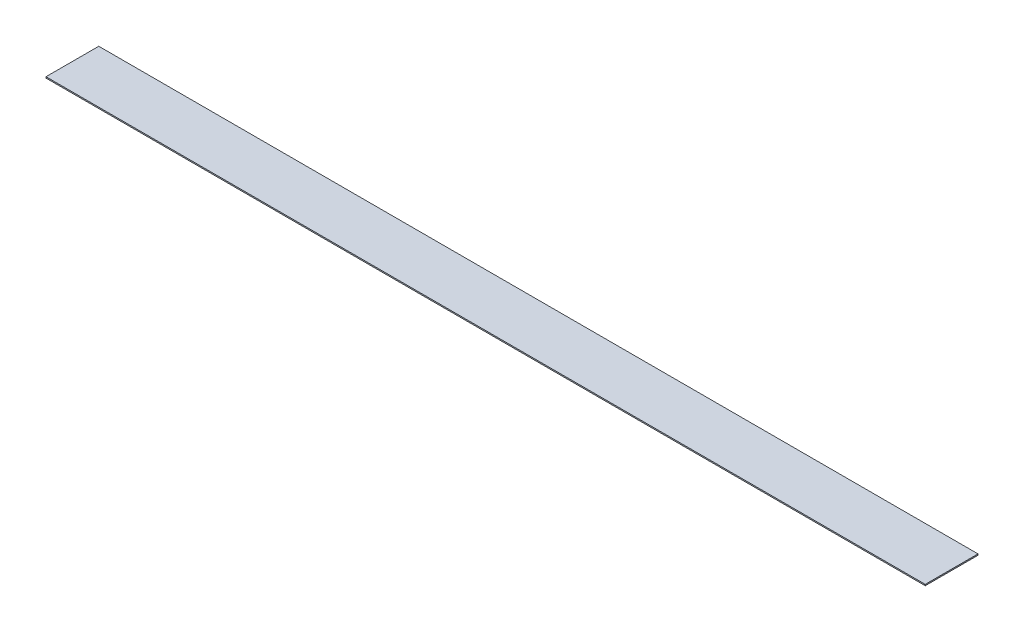
ISO-10303-21;
HEADER;
FILE_DESCRIPTION(('STEP AP214'),'2;1');
FILE_NAME('part.step','',(''),(''),'','','');
FILE_SCHEMA(('AUTOMOTIVE_DESIGN { 1 0 10303 214 1 1 1 1 }'));
ENDSEC;
DATA;
#1=APPLICATION_CONTEXT('core data for automotive mechanical design processes');
#2=APPLICATION_PROTOCOL_DEFINITION('international standard','automotive_design',2000,#1);
#3=PRODUCT_CONTEXT('',#1,'mechanical');
#4=PRODUCT('Part','Part','',(#3));
#5=PRODUCT_RELATED_PRODUCT_CATEGORY('part','',(#4));
#6=PRODUCT_DEFINITION_FORMATION('','',#4);
#7=PRODUCT_DEFINITION_CONTEXT('part definition',#1,'design');
#8=PRODUCT_DEFINITION('design','',#6,#7);
#9=PRODUCT_DEFINITION_SHAPE('','',#8);
#10=(LENGTH_UNIT() NAMED_UNIT(*) SI_UNIT(.MILLI.,.METRE.));
#11=(NAMED_UNIT(*) PLANE_ANGLE_UNIT() SI_UNIT($,.RADIAN.));
#12=(NAMED_UNIT(*) SI_UNIT($,.STERADIAN.) SOLID_ANGLE_UNIT());
#13=UNCERTAINTY_MEASURE_WITH_UNIT(LENGTH_MEASURE(1.E-05),#10,'distance_accuracy_value','');
#14=(GEOMETRIC_REPRESENTATION_CONTEXT(3) GLOBAL_UNCERTAINTY_ASSIGNED_CONTEXT((#13)) GLOBAL_UNIT_ASSIGNED_CONTEXT((#10,
#11,#12)) REPRESENTATION_CONTEXT('',''));
#15=CARTESIAN_POINT('',(0.,0.,0.));
#16=DIRECTION('',(0.,0.,1.));
#17=DIRECTION('',(1.,0.,0.));
#18=AXIS2_PLACEMENT_3D('',#15,#16,#17);
#19=CARTESIAN_POINT('',(25.,0.07,-1.5));
#20=DIRECTION('',(-1.,0.,0.));
#21=DIRECTION('',(0.,0.,1.));
#22=AXIS2_PLACEMENT_3D('',#19,#20,#21);
#23=PLANE('',#22);
#24=DIRECTION('',(0.,0.,-1.));
#25=VECTOR('',#24,1.);
#26=CARTESIAN_POINT('',(25.,0.,-1.5));
#27=LINE('',#26,#25);
#28=CARTESIAN_POINT('',(25.,0.,1.5));
#29=VERTEX_POINT('',#28);
#30=CARTESIAN_POINT('',(25.,0.,-1.5));
#31=VERTEX_POINT('',#30);
#32=EDGE_CURVE('E100',#29,#31,#27,.T.);
#33=ORIENTED_EDGE('',*,*,#32,.T.);
#34=DIRECTION('',(0.,-1.,0.));
#35=VECTOR('',#34,1.);
#36=CARTESIAN_POINT('',(25.,0.07,-1.5));
#37=LINE('',#36,#35);
#38=CARTESIAN_POINT('',(25.,0.07,-1.5));
#39=VERTEX_POINT('',#38);
#40=EDGE_CURVE('E11',#39,#31,#37,.T.);
#41=ORIENTED_EDGE('',*,*,#40,.F.);
#42=DIRECTION('',(0.,0.,-1.));
#43=VECTOR('',#42,1.);
#44=CARTESIAN_POINT('',(25.,0.07,-1.5));
#45=LINE('',#44,#43);
#46=CARTESIAN_POINT('',(25.,0.07,1.5));
#47=VERTEX_POINT('',#46);
#48=EDGE_CURVE('E88',#47,#39,#45,.T.);
#49=ORIENTED_EDGE('',*,*,#48,.F.);
#50=DIRECTION('',(0.,-1.,0.));
#51=VECTOR('',#50,1.);
#52=CARTESIAN_POINT('',(25.,0.07,1.5));
#53=LINE('',#52,#51);
#54=EDGE_CURVE('E96',#47,#29,#53,.T.);
#55=ORIENTED_EDGE('',*,*,#54,.T.);
#56=EDGE_LOOP('',(#33,#41,#49,#55));
#57=FACE_BOUND('',#56,.T.);
#58=ADVANCED_FACE('F37',(#57),#23,.F.);
#59=CARTESIAN_POINT('',(-25.,0.07,-1.5));
#60=DIRECTION('',(0.,0.,1.));
#61=DIRECTION('',(1.,0.,0.));
#62=AXIS2_PLACEMENT_3D('',#59,#60,#61);
#63=PLANE('',#62);
#64=DIRECTION('',(-1.,0.,0.));
#65=VECTOR('',#64,1.);
#66=CARTESIAN_POINT('',(-25.,0.,-1.5));
#67=LINE('',#66,#65);
#68=CARTESIAN_POINT('',(-25.,0.,-1.5));
#69=VERTEX_POINT('',#68);
#70=EDGE_CURVE('E92',#31,#69,#67,.T.);
#71=ORIENTED_EDGE('',*,*,#70,.T.);
#72=DIRECTION('',(0.,-1.,0.));
#73=VECTOR('',#72,1.);
#74=CARTESIAN_POINT('',(-25.,0.07,-1.5));
#75=LINE('',#74,#73);
#76=CARTESIAN_POINT('',(-25.,0.07,-1.5));
#77=VERTEX_POINT('',#76);
#78=EDGE_CURVE('E45',#77,#69,#75,.T.);
#79=ORIENTED_EDGE('',*,*,#78,.F.);
#80=DIRECTION('',(-1.,0.,0.));
#81=VECTOR('',#80,1.);
#82=CARTESIAN_POINT('',(-25.,0.07,-1.5));
#83=LINE('',#82,#81);
#84=EDGE_CURVE('E83',#39,#77,#83,.T.);
#85=ORIENTED_EDGE('',*,*,#84,.F.);
#86=ORIENTED_EDGE('',*,*,#40,.T.);
#87=EDGE_LOOP('',(#71,#79,#85,#86));
#88=FACE_BOUND('',#87,.T.);
#89=ADVANCED_FACE('F91',(#88),#63,.F.);
#90=CARTESIAN_POINT('',(-25.,0.07,-1.5));
#91=DIRECTION('',(1.,0.,0.));
#92=DIRECTION('',(0.,0.,-1.));
#93=AXIS2_PLACEMENT_3D('',#90,#91,#92);
#94=PLANE('',#93);
#95=DIRECTION('',(0.,0.,1.));
#96=VECTOR('',#95,1.);
#97=CARTESIAN_POINT('',(-25.,0.,-1.5));
#98=LINE('',#97,#96);
#99=CARTESIAN_POINT('',(-25.,0.,1.5));
#100=VERTEX_POINT('',#99);
#101=EDGE_CURVE('E70',#69,#100,#98,.T.);
#102=ORIENTED_EDGE('',*,*,#101,.T.);
#103=DIRECTION('',(0.,-1.,0.));
#104=VECTOR('',#103,1.);
#105=CARTESIAN_POINT('',(-25.,0.07,1.5));
#106=LINE('',#105,#104);
#107=CARTESIAN_POINT('',(-25.,0.07,1.5));
#108=VERTEX_POINT('',#107);
#109=EDGE_CURVE('E93',#108,#100,#106,.T.);
#110=ORIENTED_EDGE('',*,*,#109,.F.);
#111=DIRECTION('',(0.,0.,1.));
#112=VECTOR('',#111,1.);
#113=CARTESIAN_POINT('',(-25.,0.07,-1.5));
#114=LINE('',#113,#112);
#115=EDGE_CURVE('E86',#77,#108,#114,.T.);
#116=ORIENTED_EDGE('',*,*,#115,.F.);
#117=ORIENTED_EDGE('',*,*,#78,.T.);
#118=EDGE_LOOP('',(#102,#110,#116,#117));
#119=FACE_BOUND('',#118,.T.);
#120=ADVANCED_FACE('F94',(#119),#94,.F.);
#121=CARTESIAN_POINT('',(-25.,0.07,1.5));
#122=DIRECTION('',(0.,0.,-1.));
#123=DIRECTION('',(-1.,0.,0.));
#124=AXIS2_PLACEMENT_3D('',#121,#122,#123);
#125=PLANE('',#124);
#126=DIRECTION('',(1.,0.,0.));
#127=VECTOR('',#126,1.);
#128=CARTESIAN_POINT('',(-25.,0.,1.5));
#129=LINE('',#128,#127);
#130=EDGE_CURVE('E76',#100,#29,#129,.T.);
#131=ORIENTED_EDGE('',*,*,#130,.T.);
#132=ORIENTED_EDGE('',*,*,#54,.F.);
#133=DIRECTION('',(1.,0.,0.));
#134=VECTOR('',#133,1.);
#135=CARTESIAN_POINT('',(-25.,0.07,1.5));
#136=LINE('',#135,#134);
#137=EDGE_CURVE('E53',#108,#47,#136,.T.);
#138=ORIENTED_EDGE('',*,*,#137,.F.);
#139=ORIENTED_EDGE('',*,*,#109,.T.);
#140=EDGE_LOOP('',(#131,#132,#138,#139));
#141=FACE_BOUND('',#140,.T.);
#142=ADVANCED_FACE('F107',(#141),#125,.F.);
#143=CARTESIAN_POINT('',(0.,0.07,0.));
#144=DIRECTION('',(0.,1.,0.));
#145=DIRECTION('',(0.,0.,1.));
#146=AXIS2_PLACEMENT_3D('',#143,#144,#145);
#147=PLANE('',#146);
#148=ORIENTED_EDGE('',*,*,#48,.T.);
#149=ORIENTED_EDGE('',*,*,#84,.T.);
#150=ORIENTED_EDGE('',*,*,#115,.T.);
#151=ORIENTED_EDGE('',*,*,#137,.T.);
#152=EDGE_LOOP('',(#148,#149,#150,#151));
#153=FACE_BOUND('',#152,.T.);
#154=ADVANCED_FACE('F84',(#153),#147,.T.);
#155=CARTESIAN_POINT('',(0.,0.,0.));
#156=DIRECTION('',(0.,1.,0.));
#157=DIRECTION('',(0.,0.,1.));
#158=AXIS2_PLACEMENT_3D('',#155,#156,#157);
#159=PLANE('',#158);
#160=ORIENTED_EDGE('',*,*,#32,.F.);
#161=ORIENTED_EDGE('',*,*,#130,.F.);
#162=ORIENTED_EDGE('',*,*,#101,.F.);
#163=ORIENTED_EDGE('',*,*,#70,.F.);
#164=EDGE_LOOP('',(#160,#161,#162,#163));
#165=FACE_BOUND('',#164,.T.);
#166=ADVANCED_FACE('F110',(#165),#159,.F.);
#167=CLOSED_SHELL('',(#58,#89,#120,#142,#154,#166));
#168=MANIFOLD_SOLID_BREP('B2',#167);
#169=ADVANCED_BREP_SHAPE_REPRESENTATION('',(#18,#168),#14);
#170=SHAPE_DEFINITION_REPRESENTATION(#9,#169);
ENDSEC;
END-ISO-10303-21;
